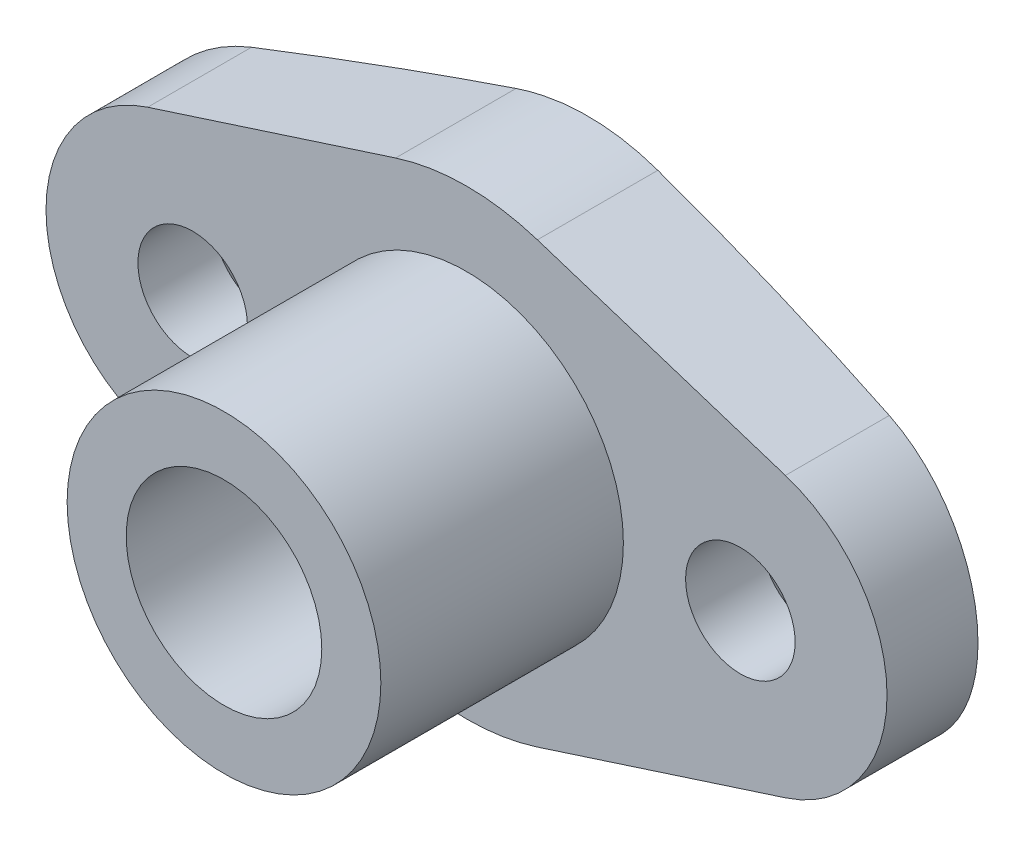
ISO-10303-21;
HEADER;
FILE_DESCRIPTION(('STEP AP214'),'2;1');
FILE_NAME('part.step','',(''),(''),'','','');
FILE_SCHEMA(('AUTOMOTIVE_DESIGN { 1 0 10303 214 1 1 1 1 }'));
ENDSEC;
DATA;
#1=APPLICATION_CONTEXT('core data for automotive mechanical design processes');
#2=APPLICATION_PROTOCOL_DEFINITION('international standard','automotive_design',2000,#1);
#3=PRODUCT_CONTEXT('',#1,'mechanical');
#4=PRODUCT('Part','Part','',(#3));
#5=PRODUCT_RELATED_PRODUCT_CATEGORY('part','',(#4));
#6=PRODUCT_DEFINITION_FORMATION('','',#4);
#7=PRODUCT_DEFINITION_CONTEXT('part definition',#1,'design');
#8=PRODUCT_DEFINITION('design','',#6,#7);
#9=PRODUCT_DEFINITION_SHAPE('','',#8);
#10=(LENGTH_UNIT() NAMED_UNIT(*) SI_UNIT(.MILLI.,.METRE.));
#11=(NAMED_UNIT(*) PLANE_ANGLE_UNIT() SI_UNIT($,.RADIAN.));
#12=(NAMED_UNIT(*) SI_UNIT($,.STERADIAN.) SOLID_ANGLE_UNIT());
#13=UNCERTAINTY_MEASURE_WITH_UNIT(LENGTH_MEASURE(1.E-05),#10,'distance_accuracy_value','');
#14=(GEOMETRIC_REPRESENTATION_CONTEXT(3) GLOBAL_UNCERTAINTY_ASSIGNED_CONTEXT((#13)) GLOBAL_UNIT_ASSIGNED_CONTEXT((#10,
#11,#12)) REPRESENTATION_CONTEXT('',''));
#15=CARTESIAN_POINT('',(0.,0.,0.));
#16=DIRECTION('',(0.,0.,1.));
#17=DIRECTION('',(1.,0.,0.));
#18=AXIS2_PLACEMENT_3D('',#15,#16,#17);
#19=CARTESIAN_POINT('',(0.,0.,3.937));
#20=DIRECTION('',(0.,0.,1.));
#21=DIRECTION('',(1.,0.,0.));
#22=AXIS2_PLACEMENT_3D('',#19,#20,#21);
#23=PLANE('',#22);
#24=CARTESIAN_POINT('',(-8.89,0.,3.937));
#25=DIRECTION('',(0.,0.,1.));
#26=DIRECTION('',(1.,0.,0.));
#27=AXIS2_PLACEMENT_3D('',#24,#25,#26);
#28=CIRCLE('',#27,1.778);
#29=CARTESIAN_POINT('',(-7.112,0.,3.937));
#30=VERTEX_POINT('',#29);
#31=EDGE_CURVE('E255',#30,#30,#28,.T.);
#32=ORIENTED_EDGE('',*,*,#31,.F.);
#33=EDGE_LOOP('',(#32));
#34=FACE_BOUND('',#33,.T.);
#35=CARTESIAN_POINT('',(0.,0.,3.937));
#36=DIRECTION('',(0.,0.,1.));
#37=DIRECTION('',(1.,0.,0.));
#38=AXIS2_PLACEMENT_3D('',#35,#36,#37);
#39=CIRCLE('',#38,7.493);
#40=CARTESIAN_POINT('',(2.30142142857143,7.13081400739861,3.937));
#41=VERTEX_POINT('',#40);
#42=CARTESIAN_POINT('',(-2.30142142857143,7.13081400739861,3.937));
#43=VERTEX_POINT('',#42);
#44=EDGE_CURVE('E256',#41,#43,#39,.T.);
#45=ORIENTED_EDGE('',*,*,#44,.T.);
#46=DIRECTION('',(-0.951663420178648,-0.307142857142857,0.));
#47=VECTOR('',#46,1.);
#48=CARTESIAN_POINT('',(-10.3527678571429,4.53229703860081,3.937));
#49=LINE('',#48,#47);
#50=CARTESIAN_POINT('',(-10.3527678571429,4.53229703860081,3.937));
#51=VERTEX_POINT('',#50);
#52=EDGE_CURVE('E259',#43,#51,#49,.T.);
#53=ORIENTED_EDGE('',*,*,#52,.T.);
#54=CARTESIAN_POINT('',(-8.89,0.,3.937));
#55=DIRECTION('',(0.,0.,1.));
#56=DIRECTION('',(1.,0.,0.));
#57=AXIS2_PLACEMENT_3D('',#54,#55,#56);
#58=CIRCLE('',#57,4.7625);
#59=CARTESIAN_POINT('',(-10.3527678571429,-4.53229703860081,3.937));
#60=VERTEX_POINT('',#59);
#61=EDGE_CURVE('E267',#51,#60,#58,.T.);
#62=ORIENTED_EDGE('',*,*,#61,.T.);
#63=DIRECTION('',(0.951663420178648,-0.307142857142857,0.));
#64=VECTOR('',#63,1.);
#65=CARTESIAN_POINT('',(-2.30142142857143,-7.13081400739861,3.937));
#66=LINE('',#65,#64);
#67=CARTESIAN_POINT('',(-2.30142142857143,-7.13081400739861,3.937));
#68=VERTEX_POINT('',#67);
#69=EDGE_CURVE('E269',#60,#68,#66,.T.);
#70=ORIENTED_EDGE('',*,*,#69,.T.);
#71=CARTESIAN_POINT('',(0.,0.,3.937));
#72=DIRECTION('',(0.,0.,1.));
#73=DIRECTION('',(1.,0.,0.));
#74=AXIS2_PLACEMENT_3D('',#71,#72,#73);
#75=CIRCLE('',#74,7.493);
#76=CARTESIAN_POINT('',(2.30142142857143,-7.13081400739861,3.937));
#77=VERTEX_POINT('',#76);
#78=EDGE_CURVE('E271',#68,#77,#75,.T.);
#79=ORIENTED_EDGE('',*,*,#78,.T.);
#80=DIRECTION('',(0.951663420178648,0.307142857142857,0.));
#81=VECTOR('',#80,1.);
#82=CARTESIAN_POINT('',(10.3527678571429,-4.53229703860081,3.937));
#83=LINE('',#82,#81);
#84=CARTESIAN_POINT('',(10.3527678571429,-4.53229703860081,3.937));
#85=VERTEX_POINT('',#84);
#86=EDGE_CURVE('E273',#77,#85,#83,.T.);
#87=ORIENTED_EDGE('',*,*,#86,.T.);
#88=CARTESIAN_POINT('',(8.89,0.,3.937));
#89=DIRECTION('',(0.,0.,1.));
#90=DIRECTION('',(1.,0.,0.));
#91=AXIS2_PLACEMENT_3D('',#88,#89,#90);
#92=CIRCLE('',#91,4.7625);
#93=CARTESIAN_POINT('',(10.3527678571429,4.53229703860081,3.937));
#94=VERTEX_POINT('',#93);
#95=EDGE_CURVE('E275',#85,#94,#92,.T.);
#96=ORIENTED_EDGE('',*,*,#95,.T.);
#97=DIRECTION('',(-0.951663420178648,0.307142857142857,0.));
#98=VECTOR('',#97,1.);
#99=CARTESIAN_POINT('',(2.30142142857143,7.13081400739861,3.937));
#100=LINE('',#99,#98);
#101=EDGE_CURVE('E64',#94,#41,#100,.T.);
#102=ORIENTED_EDGE('',*,*,#101,.T.);
#103=EDGE_LOOP('',(#45,#53,#62,#70,#79,#87,#96,#102));
#104=FACE_BOUND('',#103,.T.);
#105=CARTESIAN_POINT('',(8.89,0.,3.937));
#106=DIRECTION('',(0.,0.,1.));
#107=DIRECTION('',(1.,0.,0.));
#108=AXIS2_PLACEMENT_3D('',#105,#106,#107);
#109=CIRCLE('',#108,1.778);
#110=CARTESIAN_POINT('',(10.668,0.,3.937));
#111=VERTEX_POINT('',#110);
#112=EDGE_CURVE('E257',#111,#111,#109,.T.);
#113=ORIENTED_EDGE('',*,*,#112,.F.);
#114=EDGE_LOOP('',(#113));
#115=FACE_BOUND('',#114,.T.);
#116=CARTESIAN_POINT('',(0.,0.,3.937));
#117=DIRECTION('',(0.,0.,1.));
#118=DIRECTION('',(1.,0.,0.));
#119=AXIS2_PLACEMENT_3D('',#116,#117,#118);
#120=CIRCLE('',#119,5.0927);
#121=CARTESIAN_POINT('',(5.0927,0.,3.937));
#122=VERTEX_POINT('',#121);
#123=EDGE_CURVE('E345',#122,#122,#120,.T.);
#124=ORIENTED_EDGE('',*,*,#123,.F.);
#125=EDGE_LOOP('',(#124));
#126=FACE_BOUND('',#125,.T.);
#127=ADVANCED_FACE('F34',(#34,#104,#115,#126),#23,.T.);
#128=CARTESIAN_POINT('',(0.,0.,3.937));
#129=DIRECTION('',(0.,0.,-1.));
#130=DIRECTION('',(-1.,0.,0.));
#131=AXIS2_PLACEMENT_3D('',#128,#129,#130);
#132=CYLINDRICAL_SURFACE('',#131,7.493);
#133=DIRECTION('',(0.,0.,-1.));
#134=VECTOR('',#133,1.);
#135=CARTESIAN_POINT('',(2.30142142857143,7.13081400739861,3.937));
#136=LINE('',#135,#134);
#137=CARTESIAN_POINT('',(2.30142142857143,7.13081400739861,0.0278282241928558));
#138=VERTEX_POINT('',#137);
#139=EDGE_CURVE('E126',#41,#138,#136,.T.);
#140=ORIENTED_EDGE('',*,*,#139,.T.);
#141=CARTESIAN_POINT('',(2.30142142857143,7.13081400739861,0.0278282241928524));
#142=CARTESIAN_POINT('',(2.09893669095987,7.19619049432216,0.0229238411908637));
#143=CARTESIAN_POINT('',(1.89363949052778,7.2529004168199,0.0186115777028834));
#144=CARTESIAN_POINT('',(1.47893743579942,7.34867213095504,0.0112668344274041));
#145=CARTESIAN_POINT('',(1.26953241501502,7.3877332057441,0.00823440662369008));
#146=CARTESIAN_POINT('',(0.853554029363216,7.44711523342096,0.00360544338788841));
#147=CARTESIAN_POINT('',(0.647045845973879,7.46789125837851,0.00197406575556063));
#148=CARTESIAN_POINT('',(0.233035198819904,7.49224421426062,6.03857751943333E-05));
#149=CARTESIAN_POINT('',(0.025532896008322,7.49582384104805,-0.000222128032891183));
#150=CARTESIAN_POINT('',(-0.359497641897266,7.48648347616341,0.000512814877448059));
#151=CARTESIAN_POINT('',(-0.537085395144513,7.47584103171259,0.00135083818922738));
#152=CARTESIAN_POINT('',(-0.891048073036457,7.44195474370643,0.0040064301992309));
#153=CARTESIAN_POINT('',(-1.06742302630536,7.41871119860013,0.00582397569809078));
#154=CARTESIAN_POINT('',(-1.42201467794894,7.35907318958998,0.0104547284345011));
#155=CARTESIAN_POINT('',(-1.60018323275425,7.32239401599094,0.0132894617966665));
#156=CARTESIAN_POINT('',(-1.95339145336162,7.2361877474912,0.0198822920629327));
#157=CARTESIAN_POINT('',(-2.12843071078465,7.18665898859126,0.0236405085531795));
#158=CARTESIAN_POINT('',(-2.30142142857143,7.13081400739861,0.0278282241928492));
#159=B_SPLINE_CURVE_WITH_KNOTS('',3,(#141,#142,#143,#144,#145,#146,#147,#148,#149,#150,#151,
#152,#153,#154,#155,#156,#157,#158),.UNSPECIFIED.,.F.,.F.,(4,2,2,2,2,2,2,2,4),(0.,
0.638310074126507,1.27664607234727,1.89860542999377,2.520467280485,3.05375236768147,
3.58702482491251,4.13232151314275,4.67768885163659),.UNSPECIFIED.);
#160=CARTESIAN_POINT('',(-2.30142142857143,7.13081400739861,0.0278282241928697));
#161=VERTEX_POINT('',#160);
#162=EDGE_CURVE('E56',#138,#161,#159,.T.);
#163=ORIENTED_EDGE('',*,*,#162,.T.);
#164=DIRECTION('',(0.,0.,-1.));
#165=VECTOR('',#164,1.);
#166=CARTESIAN_POINT('',(-2.30142142857143,7.13081400739861,3.937));
#167=LINE('',#166,#165);
#168=EDGE_CURVE('E48',#43,#161,#167,.T.);
#169=ORIENTED_EDGE('',*,*,#168,.F.);
#170=ORIENTED_EDGE('',*,*,#44,.F.);
#171=EDGE_LOOP('',(#140,#163,#169,#170));
#172=FACE_BOUND('',#171,.T.);
#173=ADVANCED_FACE('F36',(#172),#132,.T.);
#174=CARTESIAN_POINT('',(-10.3527678571429,4.53229703860081,3.937));
#175=DIRECTION('',(0.307142857142857,-0.951663420178648,0.));
#176=DIRECTION('',(0.951663420178648,0.307142857142857,0.));
#177=AXIS2_PLACEMENT_3D('',#174,#175,#176);
#178=PLANE('',#177);
#179=ORIENTED_EDGE('',*,*,#168,.T.);
#180=CARTESIAN_POINT('',(0.,7.87358202608376,95.1788185483871));
#181=DIRECTION('',(0.307142857142857,-0.951663420178648,0.));
#182=DIRECTION('',(0.951663420178648,0.307142857142857,0.));
#183=AXIS2_PLACEMENT_3D('',#180,#181,#182);
#184=ELLIPSE('',#183,100.013110234415,95.1788185483871);
#185=CARTESIAN_POINT('',(-10.3527678571429,4.53229703860081,0.564719715481096));
#186=VERTEX_POINT('',#185);
#187=EDGE_CURVE('E153',#161,#186,#184,.F.);
#188=ORIENTED_EDGE('',*,*,#187,.T.);
#189=DIRECTION('',(0.,0.,-1.));
#190=VECTOR('',#189,1.);
#191=CARTESIAN_POINT('',(-10.3527678571429,4.53229703860081,3.937));
#192=LINE('',#191,#190);
#193=EDGE_CURVE('E141',#51,#186,#192,.T.);
#194=ORIENTED_EDGE('',*,*,#193,.F.);
#195=ORIENTED_EDGE('',*,*,#52,.F.);
#196=EDGE_LOOP('',(#179,#188,#194,#195));
#197=FACE_BOUND('',#196,.T.);
#198=ADVANCED_FACE('F202',(#197),#178,.F.);
#199=CARTESIAN_POINT('',(-8.89,0.,3.937));
#200=DIRECTION('',(0.,0.,-1.));
#201=DIRECTION('',(-1.,0.,0.));
#202=AXIS2_PLACEMENT_3D('',#199,#200,#201);
#203=CYLINDRICAL_SURFACE('',#202,4.7625);
#204=ORIENTED_EDGE('',*,*,#193,.T.);
#205=CARTESIAN_POINT('',(-10.3527678571429,4.53229703860081,0.564719715481096));
#206=CARTESIAN_POINT('',(-10.4807240716005,4.49101438281044,0.578718635350322));
#207=CARTESIAN_POINT('',(-10.6069141046586,4.44429093531857,0.592791281092909));
#208=CARTESIAN_POINT('',(-10.854891766469,4.3403508063711,0.62093000068568));
#209=CARTESIAN_POINT('',(-10.9766795512806,4.28313449732412,0.634996074751346));
#210=CARTESIAN_POINT('',(-11.2149393341914,4.15862146957118,0.662962475053026));
#211=CARTESIAN_POINT('',(-11.3314136527307,4.09132920718806,0.676862871644233));
#212=CARTESIAN_POINT('',(-11.5582805699341,3.94711902309484,0.704342098100428));
#213=CARTESIAN_POINT('',(-11.668673252418,3.87020123409578,0.717920932395857));
#214=CARTESIAN_POINT('',(-11.8826319147423,3.7072430362519,0.744597047987976));
#215=CARTESIAN_POINT('',(-11.986195452181,3.62119939199134,0.757694156265685));
#216=CARTESIAN_POINT('',(-12.1857482457858,3.44057664271031,0.783240451206981));
#217=CARTESIAN_POINT('',(-12.2817346877875,3.34599439411418,0.795689396561239));
#218=CARTESIAN_POINT('',(-12.465338747197,3.14904315455856,0.819762807111599));
#219=CARTESIAN_POINT('',(-12.5529615775804,3.04667908638346,0.831387784701793));
#220=CARTESIAN_POINT('',(-12.7192974122617,2.83479013749181,0.853668032698847));
#221=CARTESIAN_POINT('',(-12.7980071363112,2.7252626436968,0.864322945816516));
#222=CARTESIAN_POINT('',(-12.9455887294019,2.50032499823664,0.88446686895594));
#223=CARTESIAN_POINT('',(-13.014500282939,2.3849413035189,0.893960558955323));
#224=CARTESIAN_POINT('',(-13.1423861872245,2.14864426071958,0.911701498419454));
#225=CARTESIAN_POINT('',(-13.2013568497116,2.02772888133814,0.919948285142697));
#226=CARTESIAN_POINT('',(-13.3088728103566,1.78130184624,0.935068871058859));
#227=CARTESIAN_POINT('',(-13.3574207366646,1.65579135857059,0.941943016340215));
#228=CARTESIAN_POINT('',(-13.4437570473167,1.40100048778936,0.954220907632167));
#229=CARTESIAN_POINT('',(-13.4815414941204,1.27171874407845,0.959624115506397));
#230=CARTESIAN_POINT('',(-13.5457298367684,1.01161206157154,0.968831043989088));
#231=CARTESIAN_POINT('',(-13.572238623119,0.88081352036234,0.972649498102113));
#232=CARTESIAN_POINT('',(-13.6141989168594,0.617371317508529,0.978704224269362));
#233=CARTESIAN_POINT('',(-13.6296465912412,0.484727032474747,0.980939947856832));
#234=CARTESIAN_POINT('',(-13.64934883687,0.218629817254097,0.983792798309386));
#235=CARTESIAN_POINT('',(-13.653606537846,0.0851771236402106,0.984410377753847));
#236=CARTESIAN_POINT('',(-13.6509052749684,-0.181612218703446,0.984018865341523));
#237=CARTESIAN_POINT('',(-13.6439463377357,-0.31494886770788,0.983009777345386));
#238=CARTESIAN_POINT('',(-13.6189399342605,-0.579754200415433,0.979391091960798));
#239=CARTESIAN_POINT('',(-13.6009587404115,-0.711229279299552,0.976791060441067));
#240=CARTESIAN_POINT('',(-13.5541093834534,-0.972137191508094,0.970038819074804));
#241=CARTESIAN_POINT('',(-13.5252450148825,-1.10157072027315,0.965887150228049));
#242=CARTESIAN_POINT('',(-13.4568326135945,-1.35757391186498,0.956091197780154));
#243=CARTESIAN_POINT('',(-13.4172807892038,-1.48414254098385,0.950446384459298));
#244=CARTESIAN_POINT('',(-13.3278080955623,-1.73343516443144,0.93774963069887));
#245=CARTESIAN_POINT('',(-13.2778909525758,-1.85616052219508,0.930698195966242));
#246=CARTESIAN_POINT('',(-13.167913248285,-2.09725099879621,0.915269656579925));
#247=CARTESIAN_POINT('',(-13.1078285070819,-2.21560488456278,0.906889394862657));
#248=CARTESIAN_POINT('',(-12.9780621110896,-2.44677712907327,0.888937380394494));
#249=CARTESIAN_POINT('',(-12.9083839061824,-2.55959745803467,0.879366056077176));
#250=CARTESIAN_POINT('',(-12.759874614786,-2.77903556100433,0.859156140933052));
#251=CARTESIAN_POINT('',(-12.681038384334,-2.88564979816194,0.848516950758238));
#252=CARTESIAN_POINT('',(-12.5148369615106,-3.0918428080141,0.826323191371494));
#253=CARTESIAN_POINT('',(-12.4274748046747,-3.19142406309394,0.814768948225404));
#254=CARTESIAN_POINT('',(-12.2439652943168,-3.3838082418718,0.790781947661529));
#255=CARTESIAN_POINT('',(-12.1477439574898,-3.47653971075503,0.778342034502557));
#256=CARTESIAN_POINT('',(-11.9479356895249,-3.65352449641327,0.752845052165041));
#257=CARTESIAN_POINT('',(-11.8443514028229,-3.73778083107471,0.739788205120268));
#258=CARTESIAN_POINT('',(-11.6305790389929,-3.89723012304133,0.713223108786843));
#259=CARTESIAN_POINT('',(-11.5203949031519,-3.97242841039437,0.699715130994761));
#260=CARTESIAN_POINT('',(-11.294176324256,-4.11328229166416,0.67240574621263));
#261=CARTESIAN_POINT('',(-11.1781440098081,-4.17894132435225,0.658604447027811));
#262=CARTESIAN_POINT('',(-10.945837288094,-4.29781993964852,0.631427073389094));
#263=CARTESIAN_POINT('',(-10.8297656874801,-4.35143759062662,0.618056607882819));
#264=CARTESIAN_POINT('',(-10.5939104255628,-4.44908792426354,0.591342054994672));
#265=CARTESIAN_POINT('',(-10.4741340398227,-4.49313818052713,0.57799796463509));
#266=CARTESIAN_POINT('',(-10.3527678571429,-4.53229703860081,0.564719715481085));
#267=B_SPLINE_CURVE_WITH_KNOTS('',3,(#205,#206,#207,#208,#209,#210,#211,#212,#213,#214,#215,
#216,#217,#218,#219,#220,#221,#222,#223,#224,#225,#226,#227,#228,#229,#230,#231,#232,#233,#234,
#235,#236,#237,#238,#239,#240,#241,#242,#243,#244,#245,#246,#247,#248,#249,#250,#251,#252,#253,
#254,#255,#256,#257,#258,#259,#260,#261,#262,#263,#264,#265,#266),.UNSPECIFIED.,.F.,.F.,(4,2,2,
2,2,2,2,2,2,2,2,2,2,2,2,2,2,2,2,2,2,2,2,2,2,2,2,2,2,2,4),(0.,0.405409996876288,
0.810805607880753,1.21602245003745,1.62123370592064,2.02658910580084,2.43209435485917,
2.83734518213982,3.24274467056365,3.64645234866032,4.0503094819571,4.45406466054422,
4.85796735339202,5.25802595033208,5.65822311260117,6.05830833161335,6.45839260108585,
6.85609460419368,7.25365807217251,7.65136277251163,8.04892474736628,8.44744581750734,
8.84582394895955,9.24442693698694,9.64288852224103,10.0450467280075,10.447061219647,
10.8488379852341,11.2504695544747,11.6357237721246,12.0202642466714),.UNSPECIFIED.);
#268=CARTESIAN_POINT('',(-10.3527678571429,-4.53229703860081,0.564719715481141));
#269=VERTEX_POINT('',#268);
#270=EDGE_CURVE('E158',#186,#269,#267,.T.);
#271=ORIENTED_EDGE('',*,*,#270,.T.);
#272=DIRECTION('',(0.,0.,-1.));
#273=VECTOR('',#272,1.);
#274=CARTESIAN_POINT('',(-10.3527678571429,-4.53229703860081,3.937));
#275=LINE('',#274,#273);
#276=EDGE_CURVE('E138',#60,#269,#275,.T.);
#277=ORIENTED_EDGE('',*,*,#276,.F.);
#278=ORIENTED_EDGE('',*,*,#61,.F.);
#279=EDGE_LOOP('',(#204,#271,#277,#278));
#280=FACE_BOUND('',#279,.T.);
#281=ADVANCED_FACE('F197',(#280),#203,.T.);
#282=CARTESIAN_POINT('',(-2.30142142857143,-7.13081400739861,3.937));
#283=DIRECTION('',(0.307142857142857,0.951663420178648,0.));
#284=DIRECTION('',(-0.951663420178648,0.307142857142857,0.));
#285=AXIS2_PLACEMENT_3D('',#282,#283,#284);
#286=PLANE('',#285);
#287=ORIENTED_EDGE('',*,*,#276,.T.);
#288=CARTESIAN_POINT('',(0.,-7.87358202608376,95.1788185483871));
#289=DIRECTION('',(0.307142857142857,0.951663420178648,0.));
#290=DIRECTION('',(-0.951663420178648,0.307142857142857,0.));
#291=AXIS2_PLACEMENT_3D('',#288,#289,#290);
#292=ELLIPSE('',#291,100.013110234415,95.1788185483871);
#293=CARTESIAN_POINT('',(-2.30142142857142,-7.13081400739861,0.0278282241928524));
#294=VERTEX_POINT('',#293);
#295=EDGE_CURVE('E196',#269,#294,#292,.F.);
#296=ORIENTED_EDGE('',*,*,#295,.T.);
#297=DIRECTION('',(0.,0.,-1.));
#298=VECTOR('',#297,1.);
#299=CARTESIAN_POINT('',(-2.30142142857143,-7.13081400739861,3.937));
#300=LINE('',#299,#298);
#301=EDGE_CURVE('E135',#68,#294,#300,.T.);
#302=ORIENTED_EDGE('',*,*,#301,.F.);
#303=ORIENTED_EDGE('',*,*,#69,.F.);
#304=EDGE_LOOP('',(#287,#296,#302,#303));
#305=FACE_BOUND('',#304,.T.);
#306=ADVANCED_FACE('F201',(#305),#286,.F.);
#307=CARTESIAN_POINT('',(0.,0.,3.937));
#308=DIRECTION('',(0.,0.,-1.));
#309=DIRECTION('',(-1.,0.,0.));
#310=AXIS2_PLACEMENT_3D('',#307,#308,#309);
#311=CYLINDRICAL_SURFACE('',#310,7.493);
#312=ORIENTED_EDGE('',*,*,#301,.T.);
#313=CARTESIAN_POINT('',(-2.30142142857142,-7.13081400739861,0.0278282241928524));
#314=CARTESIAN_POINT('',(-2.09893669095987,-7.19619049432216,0.0229238411908637));
#315=CARTESIAN_POINT('',(-1.89363949052778,-7.2529004168199,0.0186115777028833));
#316=CARTESIAN_POINT('',(-1.47893743579942,-7.34867213095504,0.0112668344274041));
#317=CARTESIAN_POINT('',(-1.26953241501502,-7.3877332057441,0.00823440662369005));
#318=CARTESIAN_POINT('',(-0.853554029363214,-7.44711523342096,0.00360544338788837));
#319=CARTESIAN_POINT('',(-0.647045845973876,-7.46789125837851,0.0019740657555606));
#320=CARTESIAN_POINT('',(-0.233035198819901,-7.49224421426062,6.03857751943045E-05));
#321=CARTESIAN_POINT('',(-0.0255328960083191,-7.49582384104805,-0.000222128032891205));
#322=CARTESIAN_POINT('',(0.359497641897269,-7.48648347616341,0.000512814877448059));
#323=CARTESIAN_POINT('',(0.537085395144516,-7.47584103171259,0.00135083818922739));
#324=CARTESIAN_POINT('',(0.891048073036459,-7.44195474370643,0.00400643019923093));
#325=CARTESIAN_POINT('',(1.06742302630536,-7.41871119860013,0.00582397569809082));
#326=CARTESIAN_POINT('',(1.42201467794894,-7.35907318958998,0.0104547284345012));
#327=CARTESIAN_POINT('',(1.60018323275426,-7.32239401599094,0.0132894617966666));
#328=CARTESIAN_POINT('',(1.95339145336162,-7.2361877474912,0.0198822920629327));
#329=CARTESIAN_POINT('',(2.12843071078465,-7.18665898859126,0.0236405085531796));
#330=CARTESIAN_POINT('',(2.30142142857143,-7.13081400739861,0.0278282241928493));
#331=B_SPLINE_CURVE_WITH_KNOTS('',3,(#313,#314,#315,#316,#317,#318,#319,#320,#321,#322,#323,
#324,#325,#326,#327,#328,#329,#330),.UNSPECIFIED.,.F.,.F.,(4,2,2,2,2,2,2,2,4),(0.,
0.638310074126507,1.27664607234727,1.89860542999377,2.520467280485,3.05375236768147,
3.58702482491251,4.13232151314274,4.67768885163658),.UNSPECIFIED.);
#332=CARTESIAN_POINT('',(2.30142142857143,-7.13081400739861,0.0278282241928558));
#333=VERTEX_POINT('',#332);
#334=EDGE_CURVE('E186',#294,#333,#331,.T.);
#335=ORIENTED_EDGE('',*,*,#334,.T.);
#336=DIRECTION('',(0.,0.,-1.));
#337=VECTOR('',#336,1.);
#338=CARTESIAN_POINT('',(2.30142142857143,-7.13081400739861,3.937));
#339=LINE('',#338,#337);
#340=EDGE_CURVE('E128',#77,#333,#339,.T.);
#341=ORIENTED_EDGE('',*,*,#340,.F.);
#342=ORIENTED_EDGE('',*,*,#78,.F.);
#343=EDGE_LOOP('',(#312,#335,#341,#342));
#344=FACE_BOUND('',#343,.T.);
#345=ADVANCED_FACE('F290',(#344),#311,.T.);
#346=CARTESIAN_POINT('',(10.3527678571429,-4.53229703860081,3.937));
#347=DIRECTION('',(-0.307142857142857,0.951663420178648,0.));
#348=DIRECTION('',(-0.951663420178648,-0.307142857142857,0.));
#349=AXIS2_PLACEMENT_3D('',#346,#347,#348);
#350=PLANE('',#349);
#351=ORIENTED_EDGE('',*,*,#340,.T.);
#352=CARTESIAN_POINT('',(0.,-7.87358202608376,95.1788185483871));
#353=DIRECTION('',(-0.307142857142857,0.951663420178648,0.));
#354=DIRECTION('',(0.951663420178648,0.307142857142857,0.));
#355=AXIS2_PLACEMENT_3D('',#352,#353,#354);
#356=ELLIPSE('',#355,100.013110234415,95.1788185483871);
#357=CARTESIAN_POINT('',(10.3527678571429,-4.53229703860081,0.564719715481096));
#358=VERTEX_POINT('',#357);
#359=EDGE_CURVE('E116',#333,#358,#356,.F.);
#360=ORIENTED_EDGE('',*,*,#359,.T.);
#361=DIRECTION('',(0.,0.,-1.));
#362=VECTOR('',#361,1.);
#363=CARTESIAN_POINT('',(10.3527678571429,-4.53229703860081,3.937));
#364=LINE('',#363,#362);
#365=EDGE_CURVE('E114',#85,#358,#364,.T.);
#366=ORIENTED_EDGE('',*,*,#365,.F.);
#367=ORIENTED_EDGE('',*,*,#86,.F.);
#368=EDGE_LOOP('',(#351,#360,#366,#367));
#369=FACE_BOUND('',#368,.T.);
#370=ADVANCED_FACE('F281',(#369),#350,.F.);
#371=CARTESIAN_POINT('',(8.89,0.,3.937));
#372=DIRECTION('',(0.,0.,-1.));
#373=DIRECTION('',(-1.,0.,0.));
#374=AXIS2_PLACEMENT_3D('',#371,#372,#373);
#375=CYLINDRICAL_SURFACE('',#374,4.7625);
#376=ORIENTED_EDGE('',*,*,#365,.T.);
#377=CARTESIAN_POINT('',(10.3527678571429,-4.53229703860081,0.564719715481096));
#378=CARTESIAN_POINT('',(10.4807240716005,-4.49101438281044,0.578718635350322));
#379=CARTESIAN_POINT('',(10.6069141046586,-4.44429093531857,0.592791281092909));
#380=CARTESIAN_POINT('',(10.854891766469,-4.3403508063711,0.62093000068568));
#381=CARTESIAN_POINT('',(10.9766795512806,-4.28313449732412,0.634996074751347));
#382=CARTESIAN_POINT('',(11.2149393341914,-4.15862146957118,0.662962475053027));
#383=CARTESIAN_POINT('',(11.3314136527307,-4.09132920718806,0.676862871644233));
#384=CARTESIAN_POINT('',(11.5582805699341,-3.94711902309484,0.704342098100428));
#385=CARTESIAN_POINT('',(11.668673252418,-3.87020123409578,0.717920932395858));
#386=CARTESIAN_POINT('',(11.8826319147423,-3.7072430362519,0.744597047987976));
#387=CARTESIAN_POINT('',(11.986195452181,-3.62119939199134,0.757694156265685));
#388=CARTESIAN_POINT('',(12.1857482457858,-3.44057664271031,0.783240451206981));
#389=CARTESIAN_POINT('',(12.2817346877875,-3.34599439411418,0.795689396561239));
#390=CARTESIAN_POINT('',(12.465338747197,-3.14904315455855,0.8197628071116));
#391=CARTESIAN_POINT('',(12.5529615775804,-3.04667908638346,0.831387784701793));
#392=CARTESIAN_POINT('',(12.7192974122617,-2.83479013749181,0.853668032698847));
#393=CARTESIAN_POINT('',(12.7980071363112,-2.72526264369679,0.864322945816516));
#394=CARTESIAN_POINT('',(12.9455887294019,-2.50032499823663,0.884466868955941));
#395=CARTESIAN_POINT('',(13.014500282939,-2.3849413035189,0.893960558955324));
#396=CARTESIAN_POINT('',(13.1423861872245,-2.14864426071958,0.911701498419455));
#397=CARTESIAN_POINT('',(13.2013568497116,-2.02772888133813,0.919948285142698));
#398=CARTESIAN_POINT('',(13.3088728103566,-1.78130184624,0.93506887105886));
#399=CARTESIAN_POINT('',(13.3574207366646,-1.65579135857059,0.941943016340216));
#400=CARTESIAN_POINT('',(13.4437570473167,-1.40100048778936,0.954220907632168));
#401=CARTESIAN_POINT('',(13.4815414941204,-1.27171874407844,0.959624115506399));
#402=CARTESIAN_POINT('',(13.5457298367684,-1.01161206157153,0.96883104398909));
#403=CARTESIAN_POINT('',(13.572238623119,-0.880813520362337,0.972649498102115));
#404=CARTESIAN_POINT('',(13.6141989168594,-0.617371317508526,0.978704224269363));
#405=CARTESIAN_POINT('',(13.6296465912412,-0.484727032474744,0.980939947856833));
#406=CARTESIAN_POINT('',(13.64934883687,-0.218629817254094,0.983792798309387));
#407=CARTESIAN_POINT('',(13.653606537846,-0.0851771236402072,0.984410377753848));
#408=CARTESIAN_POINT('',(13.6509052749684,0.18161221870345,0.984018865341524));
#409=CARTESIAN_POINT('',(13.6439463377357,0.314948867707884,0.983009777345387));
#410=CARTESIAN_POINT('',(13.6189399342605,0.579754200415438,0.979391091960799));
#411=CARTESIAN_POINT('',(13.6009587404115,0.711229279299557,0.976791060441068));
#412=CARTESIAN_POINT('',(13.5541093834534,0.972137191508098,0.970038819074806));
#413=CARTESIAN_POINT('',(13.5252450148825,1.10157072027316,0.965887150228051));
#414=CARTESIAN_POINT('',(13.4568326135945,1.35757391186498,0.956091197780155));
#415=CARTESIAN_POINT('',(13.4172807892038,1.48414254098386,0.950446384459299));
#416=CARTESIAN_POINT('',(13.3278080955623,1.73343516443145,0.93774963069887));
#417=CARTESIAN_POINT('',(13.2778909525758,1.85616052219508,0.930698195966243));
#418=CARTESIAN_POINT('',(13.167913248285,2.09725099879622,0.915269656579928));
#419=CARTESIAN_POINT('',(13.1078285070819,2.21560488456278,0.906889394862661));
#420=CARTESIAN_POINT('',(12.9780621110896,2.44677712907327,0.8889373803945));
#421=CARTESIAN_POINT('',(12.9083839061824,2.55959745803468,0.879366056077182));
#422=CARTESIAN_POINT('',(12.759874614786,2.77903556100433,0.85915614093305));
#423=CARTESIAN_POINT('',(12.681038384334,2.88564979816195,0.848516950758227));
#424=CARTESIAN_POINT('',(12.5148369615106,3.0918428080141,0.826323191371485));
#425=CARTESIAN_POINT('',(12.4274748046747,3.19142406309394,0.814768948225406));
#426=CARTESIAN_POINT('',(12.2439652943168,3.3838082418718,0.790781947661531));
#427=CARTESIAN_POINT('',(12.1477439574898,3.47653971075503,0.778342034502551));
#428=CARTESIAN_POINT('',(11.9479356895249,3.65352449641327,0.752845052165025));
#429=CARTESIAN_POINT('',(11.8443514028229,3.73778083107471,0.73978820512025));
#430=CARTESIAN_POINT('',(11.6305790389929,3.89723012304133,0.713223108786836));
#431=CARTESIAN_POINT('',(11.5203949031519,3.97242841039437,0.699715130994766));
#432=CARTESIAN_POINT('',(11.294176324256,4.11328229166416,0.672405746212641));
#433=CARTESIAN_POINT('',(11.1781440098081,4.17894132435225,0.658604447027815));
#434=CARTESIAN_POINT('',(10.945837288094,4.29781993964852,0.631427073389094));
#435=CARTESIAN_POINT('',(10.8297656874801,4.35143759062662,0.61805660788282));
#436=CARTESIAN_POINT('',(10.5939104255628,4.44908792426354,0.591342054994676));
#437=CARTESIAN_POINT('',(10.4741340398227,4.49313818052713,0.577997964635094));
#438=CARTESIAN_POINT('',(10.3527678571429,4.53229703860081,0.564719715481088));
#439=B_SPLINE_CURVE_WITH_KNOTS('',3,(#377,#378,#379,#380,#381,#382,#383,#384,#385,#386,#387,
#388,#389,#390,#391,#392,#393,#394,#395,#396,#397,#398,#399,#400,#401,#402,#403,#404,#405,#406,
#407,#408,#409,#410,#411,#412,#413,#414,#415,#416,#417,#418,#419,#420,#421,#422,#423,#424,#425,
#426,#427,#428,#429,#430,#431,#432,#433,#434,#435,#436,#437,#438),.UNSPECIFIED.,.F.,.F.,(4,2,2,
2,2,2,2,2,2,2,2,2,2,2,2,2,2,2,2,2,2,2,2,2,2,2,2,2,2,2,4),(0.,0.405409996876288,
0.810805607880753,1.21602245003745,1.62123370592064,2.02658910580084,2.43209435485917,
2.83734518213983,3.24274467056366,3.64645234866032,4.05030948195711,4.45406466054423,
4.85796735339202,5.25802595033208,5.65822311260117,6.05830833161336,6.45839260108585,
6.85609460419368,7.25365807217251,7.65136277251163,8.04892474736629,8.44744581750734,
8.84582394895956,9.24442693698695,9.64288852224103,10.0450467280075,10.447061219647,
10.8488379852341,11.2504695544747,11.6357237721246,12.0202642466714),.UNSPECIFIED.);
#440=CARTESIAN_POINT('',(10.3527678571429,4.53229703860081,0.5647197154811));
#441=VERTEX_POINT('',#440);
#442=EDGE_CURVE('E108',#358,#441,#439,.T.);
#443=ORIENTED_EDGE('',*,*,#442,.T.);
#444=DIRECTION('',(0.,0.,-1.));
#445=VECTOR('',#444,1.);
#446=CARTESIAN_POINT('',(10.3527678571429,4.53229703860081,3.937));
#447=LINE('',#446,#445);
#448=EDGE_CURVE('E112',#94,#441,#447,.T.);
#449=ORIENTED_EDGE('',*,*,#448,.F.);
#450=ORIENTED_EDGE('',*,*,#95,.F.);
#451=EDGE_LOOP('',(#376,#443,#449,#450));
#452=FACE_BOUND('',#451,.T.);
#453=ADVANCED_FACE('F109',(#452),#375,.T.);
#454=CARTESIAN_POINT('',(2.30142142857143,7.13081400739861,3.937));
#455=DIRECTION('',(-0.307142857142857,-0.951663420178648,0.));
#456=DIRECTION('',(0.951663420178648,-0.307142857142857,0.));
#457=AXIS2_PLACEMENT_3D('',#454,#455,#456);
#458=PLANE('',#457);
#459=ORIENTED_EDGE('',*,*,#448,.T.);
#460=CARTESIAN_POINT('',(0.,7.87358202608376,95.1788185483871));
#461=DIRECTION('',(-0.307142857142857,-0.951663420178648,0.));
#462=DIRECTION('',(-0.951663420178648,0.307142857142857,0.));
#463=AXIS2_PLACEMENT_3D('',#460,#461,#462);
#464=ELLIPSE('',#463,100.013110234415,95.1788185483871);
#465=EDGE_CURVE('E117',#441,#138,#464,.F.);
#466=ORIENTED_EDGE('',*,*,#465,.T.);
#467=ORIENTED_EDGE('',*,*,#139,.F.);
#468=ORIENTED_EDGE('',*,*,#101,.F.);
#469=EDGE_LOOP('',(#459,#466,#467,#468));
#470=FACE_BOUND('',#469,.T.);
#471=ADVANCED_FACE('F125',(#470),#458,.F.);
#472=CARTESIAN_POINT('',(-8.89,0.,3.937));
#473=DIRECTION('',(0.,0.,-1.));
#474=DIRECTION('',(-1.,0.,0.));
#475=AXIS2_PLACEMENT_3D('',#472,#473,#474);
#476=CYLINDRICAL_SURFACE('',#475,1.778);
#477=CARTESIAN_POINT('',(-8.89,0.,1.4919191442332));
#478=DIRECTION('',(0.,0.,-1.));
#479=DIRECTION('',(-1.,0.,0.));
#480=AXIS2_PLACEMENT_3D('',#477,#478,#479);
#481=CIRCLE('',#480,1.778);
#482=CARTESIAN_POINT('',(-10.668,0.,1.4919191442332));
#483=VERTEX_POINT('',#482);
#484=EDGE_CURVE('E149',#483,#483,#481,.F.);
#485=ORIENTED_EDGE('',*,*,#484,.F.);
#486=EDGE_LOOP('',(#485));
#487=FACE_BOUND('',#486,.T.);
#488=ORIENTED_EDGE('',*,*,#31,.T.);
#489=EDGE_LOOP('',(#488));
#490=FACE_BOUND('',#489,.T.);
#491=ADVANCED_FACE('F246',(#487,#490),#476,.F.);
#492=CARTESIAN_POINT('',(8.89,0.,3.937));
#493=DIRECTION('',(0.,0.,-1.));
#494=DIRECTION('',(-1.,0.,0.));
#495=AXIS2_PLACEMENT_3D('',#492,#493,#494);
#496=CYLINDRICAL_SURFACE('',#495,1.778);
#497=CARTESIAN_POINT('',(8.89,0.,1.4919191442332));
#498=DIRECTION('',(0.,0.,-1.));
#499=DIRECTION('',(-1.,0.,0.));
#500=AXIS2_PLACEMENT_3D('',#497,#498,#499);
#501=CIRCLE('',#500,1.778);
#502=CARTESIAN_POINT('',(7.112,0.,1.4919191442332));
#503=VERTEX_POINT('',#502);
#504=EDGE_CURVE('E146',#503,#503,#501,.F.);
#505=ORIENTED_EDGE('',*,*,#504,.F.);
#506=EDGE_LOOP('',(#505));
#507=FACE_BOUND('',#506,.T.);
#508=ORIENTED_EDGE('',*,*,#112,.T.);
#509=EDGE_LOOP('',(#508));
#510=FACE_BOUND('',#509,.T.);
#511=ADVANCED_FACE('F242',(#507,#510),#496,.F.);
#512=CARTESIAN_POINT('',(0.,0.,11.811));
#513=DIRECTION('',(0.,0.,1.));
#514=DIRECTION('',(1.,0.,0.));
#515=AXIS2_PLACEMENT_3D('',#512,#513,#514);
#516=PLANE('',#515);
#517=CARTESIAN_POINT('',(0.,0.,11.811));
#518=DIRECTION('',(0.,0.,1.));
#519=DIRECTION('',(1.,0.,0.));
#520=AXIS2_PLACEMENT_3D('',#517,#518,#519);
#521=CIRCLE('',#520,5.0927);
#522=CARTESIAN_POINT('',(5.0927,0.,11.811));
#523=VERTEX_POINT('',#522);
#524=EDGE_CURVE('E262',#523,#523,#521,.T.);
#525=ORIENTED_EDGE('',*,*,#524,.T.);
#526=EDGE_LOOP('',(#525));
#527=FACE_BOUND('',#526,.T.);
#528=CARTESIAN_POINT('',(0.,0.,11.811));
#529=DIRECTION('',(0.,0.,1.));
#530=DIRECTION('',(1.,0.,0.));
#531=AXIS2_PLACEMENT_3D('',#528,#529,#530);
#532=CIRCLE('',#531,3.175);
#533=CARTESIAN_POINT('',(3.175,0.,11.811));
#534=VERTEX_POINT('',#533);
#535=EDGE_CURVE('E148',#534,#534,#532,.T.);
#536=ORIENTED_EDGE('',*,*,#535,.F.);
#537=EDGE_LOOP('',(#536));
#538=FACE_BOUND('',#537,.T.);
#539=ADVANCED_FACE('F235',(#527,#538),#516,.T.);
#540=CARTESIAN_POINT('',(0.,0.,11.811));
#541=DIRECTION('',(0.,0.,-1.));
#542=DIRECTION('',(-1.,0.,0.));
#543=AXIS2_PLACEMENT_3D('',#540,#541,#542);
#544=CYLINDRICAL_SURFACE('',#543,5.0927);
#545=ORIENTED_EDGE('',*,*,#524,.F.);
#546=EDGE_LOOP('',(#545));
#547=FACE_BOUND('',#546,.T.);
#548=ORIENTED_EDGE('',*,*,#123,.T.);
#549=EDGE_LOOP('',(#548));
#550=FACE_BOUND('',#549,.T.);
#551=ADVANCED_FACE('F227',(#547,#550),#544,.T.);
#552=CARTESIAN_POINT('',(0.,0.,11.811));
#553=DIRECTION('',(0.,0.,-1.));
#554=DIRECTION('',(-1.,0.,0.));
#555=AXIS2_PLACEMENT_3D('',#552,#553,#554);
#556=CYLINDRICAL_SURFACE('',#555,3.175);
#557=ORIENTED_EDGE('',*,*,#535,.T.);
#558=EDGE_LOOP('',(#557));
#559=FACE_BOUND('',#558,.T.);
#560=CARTESIAN_POINT('',(0.,0.,3.937));
#561=DIRECTION('',(0.,0.,1.));
#562=DIRECTION('',(1.,0.,0.));
#563=AXIS2_PLACEMENT_3D('',#560,#561,#562);
#564=CIRCLE('',#563,3.175);
#565=CARTESIAN_POINT('',(3.175,0.,3.937));
#566=VERTEX_POINT('',#565);
#567=EDGE_CURVE('E11',#566,#566,#564,.F.);
#568=ORIENTED_EDGE('',*,*,#567,.T.);
#569=EDGE_LOOP('',(#568));
#570=FACE_BOUND('',#569,.T.);
#571=ADVANCED_FACE('F220',(#559,#570),#556,.F.);
#572=ORIENTED_EDGE('',*,*,#567,.F.);
#573=EDGE_LOOP('',(#572));
#574=FACE_BOUND('',#573,.T.);
#575=ADVANCED_FACE('F212',(#574),#23,.T.);
#576=CARTESIAN_POINT('',(8.89,0.,0.));
#577=DIRECTION('',(0.,0.,-1.));
#578=DIRECTION('',(-1.,0.,0.));
#579=AXIS2_PLACEMENT_3D('',#576,#577,#578);
#580=CONICAL_SURFACE('',#579,3.556,0.872664625997167);
#581=CARTESIAN_POINT('',(6.55515128387173,-2.31314267005896,0.226001360004921));
#582=CARTESIAN_POINT('',(6.43782159727809,-2.20842206457348,0.217901383718121));
#583=CARTESIAN_POINT('',(6.32855478928863,-2.09451587002812,0.210577104456031));
#584=CARTESIAN_POINT('',(6.12869615689858,-1.85116038013362,0.197469574088371));
#585=CARTESIAN_POINT('',(6.03812211050243,-1.72169647183834,0.191687788477023));
#586=CARTESIAN_POINT('',(5.87036740784724,-1.4379127629903,0.181165870012882));
#587=CARTESIAN_POINT('',(5.79518299535424,-1.28240209217972,0.176570326446304));
#588=CARTESIAN_POINT('',(5.67155012487866,-0.961062482752204,0.169109165965486));
#589=CARTESIAN_POINT('',(5.62310503977235,-0.795232245368126,0.166243767285987));
#590=CARTESIAN_POINT('',(5.55370119116586,-0.455606379327766,0.162161356682138));
#591=CARTESIAN_POINT('',(5.5331137225632,-0.281734497479695,0.160966604790613));
#592=CARTESIAN_POINT('',(5.52114844600151,0.06701501421942,0.160270586571466));
#593=CARTESIAN_POINT('',(5.52977163663802,0.241892678250106,0.16076937813932));
#594=CARTESIAN_POINT('',(5.57617505459539,0.588978591540969,0.163481312183631));
#595=CARTESIAN_POINT('',(5.61415898724428,0.761159580849908,0.16570643235782));
#596=CARTESIAN_POINT('',(5.71855438790313,1.09665080440933,0.171932746674717));
#597=CARTESIAN_POINT('',(5.78496578616292,1.2599610604241,0.175933936459627));
#598=CARTESIAN_POINT('',(5.944131823427,1.57229367713344,0.18576038604119));
#599=CARTESIAN_POINT('',(6.036776425292,1.72137231264413,0.191578036806523));
#600=CARTESIAN_POINT('',(6.24600870302054,2.00156382552137,0.205107307779499));
#601=CARTESIAN_POINT('',(6.36259466385178,2.13267798864668,0.212818792330655));
#602=CARTESIAN_POINT('',(6.61480010589607,2.37140024843672,0.230055240394889));
#603=CARTESIAN_POINT('',(6.75015620812103,2.479288334251,0.239555668704833));
#604=CARTESIAN_POINT('',(7.03716780814962,2.67038243994678,0.260398682378211));
#605=CARTESIAN_POINT('',(7.18882193324604,2.75359053629374,0.271741112639391));
#606=CARTESIAN_POINT('',(7.50188441789063,2.8918404852396,0.295977513359343));
#607=CARTESIAN_POINT('',(7.66313328156241,2.94724774445198,0.308848447427208));
#608=CARTESIAN_POINT('',(7.99256658442832,3.02994330484691,0.33603456365417));
#609=CARTESIAN_POINT('',(8.16075072378527,3.05723282033895,0.350349683414496));
#610=CARTESIAN_POINT('',(8.49820377743906,3.08287394385581,0.379997085702584));
#611=CARTESIAN_POINT('',(8.6674603667694,3.08139599020851,0.395322841519627));
#612=CARTESIAN_POINT('',(9.00326097344482,3.05006502684809,0.426629993993813));
#613=CARTESIAN_POINT('',(9.16980494718819,3.02021156149309,0.442611401175185));
#614=CARTESIAN_POINT('',(9.49623152610472,2.93291585932131,0.474773679127631));
#615=CARTESIAN_POINT('',(9.65608311044786,2.87535791942012,0.490955106582401));
#616=CARTESIAN_POINT('',(9.96397488916912,2.73435202988033,0.522858945529926));
#617=CARTESIAN_POINT('',(10.1120144785479,2.65090275518066,0.538581333484991));
#618=CARTESIAN_POINT('',(10.3936299460559,2.45960280952606,0.569092618650031));
#619=CARTESIAN_POINT('',(10.5270509530271,2.35152245066139,0.58387093565606));
#620=CARTESIAN_POINT('',(10.7740998558149,2.11452481451377,0.611690217481233));
#621=CARTESIAN_POINT('',(10.8877268724881,1.98560661221495,0.624731105126984));
#622=CARTESIAN_POINT('',(11.0928940607659,1.70945981546658,0.64858007951184));
#623=CARTESIAN_POINT('',(11.1842517625334,1.5620940069725,0.659369622118346));
#624=CARTESIAN_POINT('',(11.3411537237472,1.2540395011384,0.678067208176417));
#625=CARTESIAN_POINT('',(11.4066976544427,1.09335063415446,0.685975214930159));
#626=CARTESIAN_POINT('',(11.51025984619,0.762768746999135,0.69853400354945));
#627=CARTESIAN_POINT('',(11.5482088237214,0.592853702746243,0.703176585861958));
#628=CARTESIAN_POINT('',(11.595230995934,0.249016059540261,0.708936101282909));
#629=CARTESIAN_POINT('',(11.6043043009232,0.0750934758989299,0.710053047859635));
#630=CARTESIAN_POINT('',(11.5933198639812,-0.271707007372799,0.708704423321704));
#631=CARTESIAN_POINT('',(11.5732801709933,-0.444585487600383,0.706241071854228));
#632=CARTESIAN_POINT('',(11.5046740933878,-0.784499694154066,0.697861979949398));
#633=CARTESIAN_POINT('',(11.4561075829647,-0.951535394709576,0.691946224286654));
#634=CARTESIAN_POINT('',(11.3318187880316,-1.27504546287247,0.676959957725383));
#635=CARTESIAN_POINT('',(11.2560938061917,-1.43151877960832,0.66788913347389));
#636=CARTESIAN_POINT('',(11.0796167439017,-1.72945484598424,0.647038409825093));
#637=CARTESIAN_POINT('',(10.9788643010135,-1.87091737820161,0.635258471195629));
#638=CARTESIAN_POINT('',(10.7550893335381,-2.13486898495546,0.609541249459674));
#639=CARTESIAN_POINT('',(10.632055766064,-2.25734859513502,0.595602897106964));
#640=CARTESIAN_POINT('',(10.3671825694315,-2.47971290853979,0.566204461242298));
#641=CARTESIAN_POINT('',(10.2253430701315,-2.57959776777295,0.550744388238288));
#642=CARTESIAN_POINT('',(9.9273081626524,-2.75354243218101,0.519014993726578));
#643=CARTESIAN_POINT('',(9.7711594374347,-2.82768268512192,0.502748377991368));
#644=CARTESIAN_POINT('',(9.44854432950101,-2.9483069271243,0.470008149634102));
#645=CARTESIAN_POINT('',(9.28207874104424,-2.99479304226803,0.453534553024437));
#646=CARTESIAN_POINT('',(8.94507854663889,-3.0583409030944,0.421119823409767));
#647=CARTESIAN_POINT('',(8.77459168124756,-3.075654054451,0.405175314053353));
#648=CARTESIAN_POINT('',(8.4330451618466,-3.08100565260523,0.374173903171552));
#649=CARTESIAN_POINT('',(8.26198544159034,-3.06904058800537,0.359117108333404));
#650=CARTESIAN_POINT('',(7.92585356247366,-3.01635147847528,0.330431287915095));
#651=CARTESIAN_POINT('',(7.76074111696517,-2.97588978146843,0.316790530410753));
#652=CARTESIAN_POINT('',(7.43970943173104,-2.86765769072825,0.291073696291684));
#653=CARTESIAN_POINT('',(7.28378186092163,-2.79991249555316,0.278996189449706));
#654=CARTESIAN_POINT('',(7.03059278096361,-2.66350697299343,0.25996253265344));
#655=CARTESIAN_POINT('',(6.92983007421692,-2.60129544379388,0.25256092768369));
#656=CARTESIAN_POINT('',(6.73624210552657,-2.4655013863205,0.238627125936691));
#657=CARTESIAN_POINT('',(6.64341524383118,-2.39192115824765,0.232094753786213));
#658=CARTESIAN_POINT('',(6.55515128387173,-2.31314267005896,0.226001360004921));
#659=B_SPLINE_CURVE_WITH_KNOTS('',3,(#581,#582,#583,#584,#585,#586,#587,#588,#589,#590,#591,
#592,#593,#594,#595,#596,#597,#598,#599,#600,#601,#602,#603,#604,#605,#606,#607,#608,#609,#610,
#611,#612,#613,#614,#615,#616,#617,#618,#619,#620,#621,#622,#623,#624,#625,#626,#627,#628,#629,
#630,#631,#632,#633,#634,#635,#636,#637,#638,#639,#640,#641,#642,#643,#644,#645,#646,#647,#648,
#649,#650,#651,#652,#653,#654,#655,#656,#657,#658),.UNSPECIFIED.,.T.,.F.,(4,2,2,2,2,2,2,2,2,2,2,
2,2,2,2,2,2,2,2,2,2,2,2,2,2,2,2,2,2,2,2,2,2,2,2,2,2,2,4),(0.,0.472058398506218,
0.944563706401231,1.46049914318342,1.97649964476359,2.49931196969498,3.02214216766794,
3.54863269213721,4.07512192480667,4.59943466637255,5.12370986204104,5.6412588965241,
6.15876437435402,6.66927699919074,7.1797675758038,7.6872345796931,8.19470973240876,
8.70432290523909,9.21396216324446,9.7285638518919,10.2431883905776,10.7618976874067,
11.2806135900313,11.8006273941425,12.3206392117464,12.8403287794927,13.3600206391306,
13.8797641279178,14.3995151438672,14.9195244653562,15.4395301962739,15.9578960526036,
16.4762220512117,16.9900579541295,17.5039554854791,18.0131827498563,18.5219407755235,
18.8771293523516,19.2322461586257),.UNSPECIFIED.);
#660=CARTESIAN_POINT('',(6.55515128387173,-2.31314267005896,0.226001360004921));
#661=VERTEX_POINT('',#660);
#662=EDGE_CURVE('E123',#661,#661,#659,.T.);
#663=ORIENTED_EDGE('',*,*,#662,.T.);
#664=EDGE_LOOP('',(#663));
#665=FACE_BOUND('',#664,.T.);
#666=ORIENTED_EDGE('',*,*,#504,.T.);
#667=EDGE_LOOP('',(#666));
#668=FACE_BOUND('',#667,.T.);
#669=ADVANCED_FACE('F219',(#665,#668),#580,.F.);
#670=CARTESIAN_POINT('',(-8.89,0.,0.));
#671=DIRECTION('',(0.,0.,-1.));
#672=DIRECTION('',(-1.,0.,0.));
#673=AXIS2_PLACEMENT_3D('',#670,#671,#672);
#674=CONICAL_SURFACE('',#673,3.556,0.872664625997167);
#675=CARTESIAN_POINT('',(-10.8142080005891,-2.06350995255225,0.616350276948695));
#676=CARTESIAN_POINT('',(-10.9293651904249,-1.93465577350368,0.629519651842736));
#677=CARTESIAN_POINT('',(-11.0337653945155,-1.79591136417361,0.641672057565695));
#678=CARTESIAN_POINT('',(-11.2180147235632,-1.50263158196808,0.663357855450481));
#679=CARTESIAN_POINT('',(-11.2978333368933,-1.34807689906137,0.672887991198771));
#680=CARTESIAN_POINT('',(-11.4305367608288,-1.02771332549819,0.688846521014158));
#681=CARTESIAN_POINT('',(-11.4834324385957,-0.861909006315471,0.695276166506531));
#682=CARTESIAN_POINT('',(-11.560811381497,-0.523754519989787,0.704712691770777));
#683=CARTESIAN_POINT('',(-11.5853022544363,-0.3514061183597,0.707720488030009));
#684=CARTESIAN_POINT('',(-11.6052019370968,-0.00503159445350499,0.710162939991787));
#685=CARTESIAN_POINT('',(-11.6006140089345,0.16899433744707,0.709597996491261));
#686=CARTESIAN_POINT('',(-11.5624927557592,0.513805152495871,0.704924681826842));
#687=CARTESIAN_POINT('',(-11.5289581435084,0.684589891165437,0.700816153082319));
#688=CARTESIAN_POINT('',(-11.4339120228745,1.01801163711877,0.689266599562511));
#689=CARTESIAN_POINT('',(-11.3724091982002,1.1806511559837,0.681826609166887));
#690=CARTESIAN_POINT('',(-11.2231653158244,1.49323524772986,0.663985425052722));
#691=CARTESIAN_POINT('',(-11.1354239871634,1.64317968949118,0.653584200754196));
#692=CARTESIAN_POINT('',(-10.936087781061,1.92622217744302,0.630314980653124));
#693=CARTESIAN_POINT('',(-10.8244757375416,2.05930798988434,0.617445210342948));
#694=CARTESIAN_POINT('',(-10.5805484048077,2.30469560365065,0.589841787488363));
#695=CARTESIAN_POINT('',(-10.4482331356755,2.41699742513602,0.575108136751935));
#696=CARTESIAN_POINT('',(-10.1668508829365,2.61736036447824,0.5444558559009));
#697=CARTESIAN_POINT('',(-10.0178145857251,2.70546489646643,0.528539414003599));
#698=CARTESIAN_POINT('',(-9.70698604554307,2.8550600339476,0.496157492389524));
#699=CARTESIAN_POINT('',(-9.54519427695405,2.91655162863608,0.47969203310408));
#700=CARTESIAN_POINT('',(-9.21468996221617,3.0106521957182,0.446963579274833));
#701=CARTESIAN_POINT('',(-9.04603682911746,3.04346954632606,0.430699985297212));
#702=CARTESIAN_POINT('',(-8.70554636042909,3.0798940460766,0.398809132186526));
#703=CARTESIAN_POINT('',(-8.53370923197502,3.0835030887323,0.383181831869237));
#704=CARTESIAN_POINT('',(-8.19355257784859,3.06141276505222,0.353178198960124));
#705=CARTESIAN_POINT('',(-8.02521506422013,3.03600469406314,0.338790965288716));
#706=CARTESIAN_POINT('',(-7.69516075080189,2.95704020685499,0.311440410718308));
#707=CARTESIAN_POINT('',(-7.53344367540719,2.90348496367301,0.298477030507245));
#708=CARTESIAN_POINT('',(-7.2220750497732,2.77014244418537,0.274269549249851));
#709=CARTESIAN_POINT('',(-7.07236563699352,2.69049171991013,0.263016935567738));
#710=CARTESIAN_POINT('',(-6.78827896493392,2.50723343497069,0.242276134849429));
#711=CARTESIAN_POINT('',(-6.65390192301958,2.40362553473088,0.232787972826498));
#712=CARTESIAN_POINT('',(-6.40355423012163,2.17493684722941,0.215573835539192));
#713=CARTESIAN_POINT('',(-6.28767461214321,2.04975580748414,0.207856498449568));
#714=CARTESIAN_POINT('',(-6.078189034706,1.78188842978619,0.194218907271016));
#715=CARTESIAN_POINT('',(-5.98458449682511,1.6392009754683,0.188298767871171));
#716=CARTESIAN_POINT('',(-5.82101912885157,1.33842481932521,0.178133990525305));
#717=CARTESIAN_POINT('',(-5.75137738167741,1.18016186020255,0.17391184664382));
#718=CARTESIAN_POINT('',(-5.63919876449065,0.854270307083996,0.167187085270425));
#719=CARTESIAN_POINT('',(-5.59666401781095,0.68664098052455,0.164684602481003));
#720=CARTESIAN_POINT('',(-5.5393816347453,0.344366705705027,0.16132752403771));
#721=CARTESIAN_POINT('',(-5.52501425964681,0.169657823536609,0.160495475807945));
#722=CARTESIAN_POINT('',(-5.52557420573718,-0.179717766159189,0.160528054874848));
#723=CARTESIAN_POINT('',(-5.5405029498929,-0.35438447122582,0.161392764586197));
#724=CARTESIAN_POINT('',(-5.59945611286254,-0.699789445661856,0.164848733784215));
#725=CARTESIAN_POINT('',(-5.643651587586,-0.870498475523265,0.167450144537801));
#726=CARTESIAN_POINT('',(-5.76016582741433,-1.20200107258552,0.174443000668318));
#727=CARTESIAN_POINT('',(-5.83248411841965,-1.36279480688729,0.178834415869088));
#728=CARTESIAN_POINT('',(-6.00286629295316,-1.66893132399506,0.189449078534125));
#729=CARTESIAN_POINT('',(-6.10079148989842,-1.81435158566219,0.195662479513112));
#730=CARTESIAN_POINT('',(-6.31989559130866,-2.08636692992551,0.209989806528966));
#731=CARTESIAN_POINT('',(-6.44107280297538,-2.21296338174673,0.218103594222945));
#732=CARTESIAN_POINT('',(-6.70150107396226,-2.44191933112187,0.236129749463804));
#733=CARTESIAN_POINT('',(-6.84048924815333,-2.5445798323779,0.246016659649362));
#734=CARTESIAN_POINT('',(-7.13381304912375,-2.72468720927379,0.267608478903655));
#735=CARTESIAN_POINT('',(-7.28814744600608,-2.80213610333246,0.279313242325801));
#736=CARTESIAN_POINT('',(-7.60558598155868,-2.92863312851715,0.304229967718957));
#737=CARTESIAN_POINT('',(-7.76854982727475,-2.97803780130242,0.317420329124234));
#738=CARTESIAN_POINT('',(-8.10036446261779,-3.04855362852231,0.345178455274227));
#739=CARTESIAN_POINT('',(-8.26921480078734,-3.06966694785157,0.359746114534813));
#740=CARTESIAN_POINT('',(-8.60712149951125,-3.08302308838953,0.389823446029977));
#741=CARTESIAN_POINT('',(-8.77617275585111,-3.07540749240388,0.405328128997669));
#742=CARTESIAN_POINT('',(-9.11059568433072,-3.0319412313016,0.436891347361392));
#743=CARTESIAN_POINT('',(-9.27596635717949,-2.99608299209227,0.452950030223925));
#744=CARTESIAN_POINT('',(-9.59928612077879,-2.89699913349655,0.485166303514158));
#745=CARTESIAN_POINT('',(-9.75718845695253,-2.83362135892726,0.50132394415677));
#746=CARTESIAN_POINT('',(-10.0601100125205,-2.68141355658156,0.53303227437398));
#747=CARTESIAN_POINT('',(-10.2051436143986,-2.59261242428996,0.548583630364107));
#748=CARTESIAN_POINT('',(-10.4276762120456,-2.42946259508523,0.572906559957979));
#749=CARTESIAN_POINT('',(-10.5102615098379,-2.36198301814177,0.582052160777284));
#750=CARTESIAN_POINT('',(-10.667999103368,-2.21876084392484,0.599711002546818));
#751=CARTESIAN_POINT('',(-10.7431513536834,-2.14301819616278,0.608224239632676));
#752=CARTESIAN_POINT('',(-10.8142080005891,-2.06350995255225,0.616350276948695));
#753=B_SPLINE_CURVE_WITH_KNOTS('',3,(#675,#676,#677,#678,#679,#680,#681,#682,#683,#684,#685,
#686,#687,#688,#689,#690,#691,#692,#693,#694,#695,#696,#697,#698,#699,#700,#701,#702,#703,#704,
#705,#706,#707,#708,#709,#710,#711,#712,#713,#714,#715,#716,#717,#718,#719,#720,#721,#722,#723,
#724,#725,#726,#727,#728,#729,#730,#731,#732,#733,#734,#735,#736,#737,#738,#739,#740,#741,#742,
#743,#744,#745,#746,#747,#748,#749,#750,#751,#752),.UNSPECIFIED.,.T.,.F.,(4,2,2,2,2,2,2,2,2,2,2,
2,2,2,2,2,2,2,2,2,2,2,2,2,2,2,2,2,2,2,2,2,2,2,2,2,2,2,4),(0.,0.519553758636408,1.0397498323424,
1.5597357674965,2.07958239995732,2.59937071604153,3.11918214792179,3.63883229625658,
4.15848781109397,4.67851828843101,5.19854826133814,5.71763902284375,6.2367104882323,
6.75197767050741,7.26721144882961,7.77731805220466,8.28740339850564,8.79486110746194,
9.30232600970468,9.81221608277338,10.3221386878995,10.8386099823611,11.3551217278399,
11.8785596672034,12.4020230315479,12.9285732205685,13.455114533295,13.978861135132,
14.5025696215109,15.0192865318316,15.5359620640768,16.0459125783273,16.5558240682095,
17.0632258856927,17.5707638241991,18.0811443961676,18.5909471710603,18.9115309092044,
19.2321166062726),.UNSPECIFIED.);
#754=CARTESIAN_POINT('',(-10.8142080005891,-2.06350995255225,0.616350276948695));
#755=VERTEX_POINT('',#754);
#756=EDGE_CURVE('E39',#755,#755,#753,.T.);
#757=ORIENTED_EDGE('',*,*,#756,.T.);
#758=EDGE_LOOP('',(#757));
#759=FACE_BOUND('',#758,.T.);
#760=ORIENTED_EDGE('',*,*,#484,.T.);
#761=EDGE_LOOP('',(#760));
#762=FACE_BOUND('',#761,.T.);
#763=ADVANCED_FACE('F168',(#759,#762),#674,.F.);
#764=CARTESIAN_POINT('',(0.,-38.1,95.1788185483871));
#765=DIRECTION('',(0.,1.,0.));
#766=DIRECTION('',(0.,0.,1.));
#767=AXIS2_PLACEMENT_3D('',#764,#765,#766);
#768=CYLINDRICAL_SURFACE('',#767,95.1788185483871);
#769=ORIENTED_EDGE('',*,*,#662,.F.);
#770=EDGE_LOOP('',(#769));
#771=FACE_BOUND('',#770,.T.);
#772=ORIENTED_EDGE('',*,*,#162,.F.);
#773=ORIENTED_EDGE('',*,*,#465,.F.);
#774=ORIENTED_EDGE('',*,*,#442,.F.);
#775=ORIENTED_EDGE('',*,*,#359,.F.);
#776=ORIENTED_EDGE('',*,*,#334,.F.);
#777=ORIENTED_EDGE('',*,*,#295,.F.);
#778=ORIENTED_EDGE('',*,*,#270,.F.);
#779=ORIENTED_EDGE('',*,*,#187,.F.);
#780=EDGE_LOOP('',(#772,#773,#774,#775,#776,#777,#778,#779));
#781=FACE_BOUND('',#780,.T.);
#782=ORIENTED_EDGE('',*,*,#756,.F.);
#783=EDGE_LOOP('',(#782));
#784=FACE_BOUND('',#783,.T.);
#785=ADVANCED_FACE('F119',(#771,#781,#784),#768,.T.);
#786=CLOSED_SHELL('',(#127,#173,#198,#281,#306,#345,#370,#453,#471,#491,#511,#539,#551,#571,
#575,#669,#763,#785));
#787=MANIFOLD_SOLID_BREP('B2',#786);
#788=ADVANCED_BREP_SHAPE_REPRESENTATION('',(#18,#787),#14);
#789=SHAPE_DEFINITION_REPRESENTATION(#9,#788);
ENDSEC;
END-ISO-10303-21;
